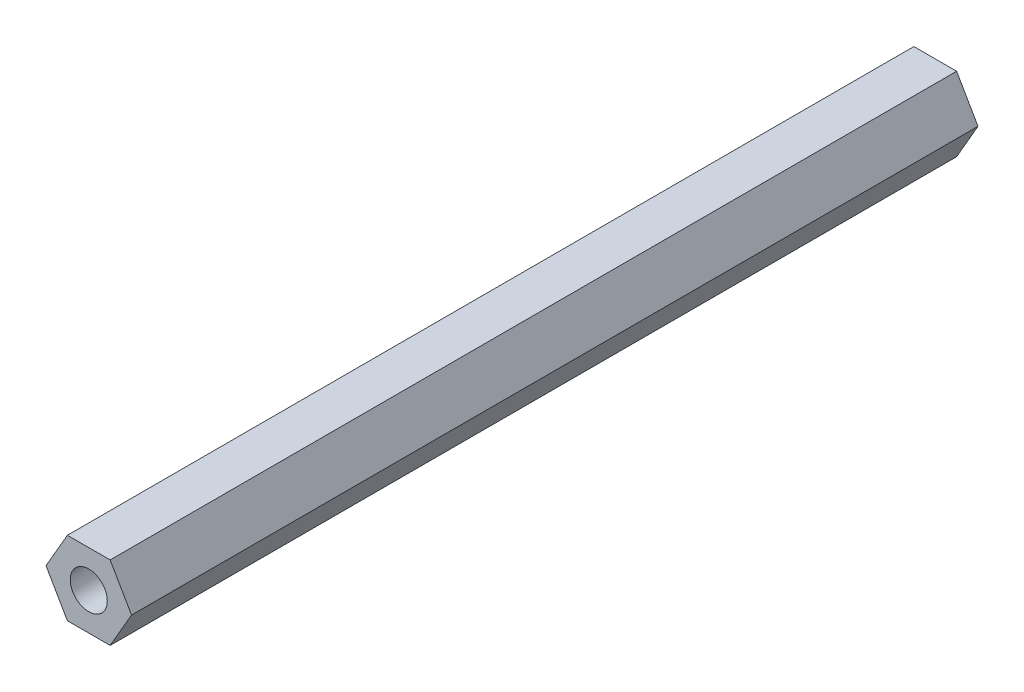
ISO-10303-21;
HEADER;
FILE_DESCRIPTION(('STEP AP214'),'2;1');
FILE_NAME('part.step','',(''),(''),'','','');
FILE_SCHEMA(('AUTOMOTIVE_DESIGN { 1 0 10303 214 1 1 1 1 }'));
ENDSEC;
DATA;
#1=APPLICATION_CONTEXT('core data for automotive mechanical design processes');
#2=APPLICATION_PROTOCOL_DEFINITION('international standard','automotive_design',2000,#1);
#3=PRODUCT_CONTEXT('',#1,'mechanical');
#4=PRODUCT('Part','Part','',(#3));
#5=PRODUCT_RELATED_PRODUCT_CATEGORY('part','',(#4));
#6=PRODUCT_DEFINITION_FORMATION('','',#4);
#7=PRODUCT_DEFINITION_CONTEXT('part definition',#1,'design');
#8=PRODUCT_DEFINITION('design','',#6,#7);
#9=PRODUCT_DEFINITION_SHAPE('','',#8);
#10=(LENGTH_UNIT() NAMED_UNIT(*) SI_UNIT(.MILLI.,.METRE.));
#11=(NAMED_UNIT(*) PLANE_ANGLE_UNIT() SI_UNIT($,.RADIAN.));
#12=(NAMED_UNIT(*) SI_UNIT($,.STERADIAN.) SOLID_ANGLE_UNIT());
#13=UNCERTAINTY_MEASURE_WITH_UNIT(LENGTH_MEASURE(1.E-05),#10,'distance_accuracy_value','');
#14=(GEOMETRIC_REPRESENTATION_CONTEXT(3) GLOBAL_UNCERTAINTY_ASSIGNED_CONTEXT((#13)) GLOBAL_UNIT_ASSIGNED_CONTEXT((#10,
#11,#12)) REPRESENTATION_CONTEXT('',''));
#15=CARTESIAN_POINT('',(0.,0.,0.));
#16=DIRECTION('',(0.,0.,1.));
#17=DIRECTION('',(1.,0.,0.));
#18=AXIS2_PLACEMENT_3D('',#15,#16,#17);
#19=CARTESIAN_POINT('',(2.02072594216369,-3.50000000000001,80.));
#20=DIRECTION('',(-0.866025403784439,0.5,0.));
#21=DIRECTION('',(-0.5,-0.866025403784439,0.));
#22=AXIS2_PLACEMENT_3D('',#19,#20,#21);
#23=PLANE('',#22);
#24=DIRECTION('',(0.5,0.866025403784439,0.));
#25=VECTOR('',#24,1.);
#26=CARTESIAN_POINT('',(2.02072594216369,-3.50000000000001,0.));
#27=LINE('',#26,#25);
#28=CARTESIAN_POINT('',(2.02072594216369,-3.50000000000001,0.));
#29=VERTEX_POINT('',#28);
#30=CARTESIAN_POINT('',(4.04145188432738,0.,0.));
#31=VERTEX_POINT('',#30);
#32=EDGE_CURVE('E117',#29,#31,#27,.T.);
#33=ORIENTED_EDGE('',*,*,#32,.T.);
#34=DIRECTION('',(0.,0.,-1.));
#35=VECTOR('',#34,1.);
#36=CARTESIAN_POINT('',(4.04145188432738,0.,80.));
#37=LINE('',#36,#35);
#38=CARTESIAN_POINT('',(4.04145188432738,0.,80.));
#39=VERTEX_POINT('',#38);
#40=EDGE_CURVE('E11',#39,#31,#37,.T.);
#41=ORIENTED_EDGE('',*,*,#40,.F.);
#42=DIRECTION('',(0.5,0.866025403784439,0.));
#43=VECTOR('',#42,1.);
#44=CARTESIAN_POINT('',(2.02072594216369,-3.50000000000001,80.));
#45=LINE('',#44,#43);
#46=CARTESIAN_POINT('',(2.02072594216369,-3.50000000000001,80.));
#47=VERTEX_POINT('',#46);
#48=EDGE_CURVE('E128',#47,#39,#45,.T.);
#49=ORIENTED_EDGE('',*,*,#48,.F.);
#50=DIRECTION('',(0.,0.,-1.));
#51=VECTOR('',#50,1.);
#52=CARTESIAN_POINT('',(2.02072594216369,-3.50000000000001,80.));
#53=LINE('',#52,#51);
#54=EDGE_CURVE('E113',#47,#29,#53,.T.);
#55=ORIENTED_EDGE('',*,*,#54,.T.);
#56=EDGE_LOOP('',(#33,#41,#49,#55));
#57=FACE_BOUND('',#56,.T.);
#58=ADVANCED_FACE('F33',(#57),#23,.F.);
#59=CARTESIAN_POINT('',(4.04145188432738,0.,80.));
#60=DIRECTION('',(-0.866025403784439,-0.5,0.));
#61=DIRECTION('',(0.5,-0.866025403784439,0.));
#62=AXIS2_PLACEMENT_3D('',#59,#60,#61);
#63=PLANE('',#62);
#64=DIRECTION('',(-0.5,0.866025403784439,0.));
#65=VECTOR('',#64,1.);
#66=CARTESIAN_POINT('',(4.04145188432738,0.,0.));
#67=LINE('',#66,#65);
#68=CARTESIAN_POINT('',(2.02072594216368,3.50000000000002,0.));
#69=VERTEX_POINT('',#68);
#70=EDGE_CURVE('E120',#31,#69,#67,.T.);
#71=ORIENTED_EDGE('',*,*,#70,.T.);
#72=DIRECTION('',(0.,0.,-1.));
#73=VECTOR('',#72,1.);
#74=CARTESIAN_POINT('',(2.02072594216368,3.50000000000002,80.));
#75=LINE('',#74,#73);
#76=CARTESIAN_POINT('',(2.02072594216368,3.50000000000002,80.));
#77=VERTEX_POINT('',#76);
#78=EDGE_CURVE('E41',#77,#69,#75,.T.);
#79=ORIENTED_EDGE('',*,*,#78,.F.);
#80=DIRECTION('',(-0.5,0.866025403784439,0.));
#81=VECTOR('',#80,1.);
#82=CARTESIAN_POINT('',(4.04145188432738,0.,80.));
#83=LINE('',#82,#81);
#84=EDGE_CURVE('E86',#39,#77,#83,.T.);
#85=ORIENTED_EDGE('',*,*,#84,.F.);
#86=ORIENTED_EDGE('',*,*,#40,.T.);
#87=EDGE_LOOP('',(#71,#79,#85,#86));
#88=FACE_BOUND('',#87,.T.);
#89=ADVANCED_FACE('F153',(#88),#63,.F.);
#90=CARTESIAN_POINT('',(2.02072594216368,3.50000000000002,80.));
#91=DIRECTION('',(0.,-1.,0.));
#92=DIRECTION('',(1.,0.,0.));
#93=AXIS2_PLACEMENT_3D('',#90,#91,#92);
#94=PLANE('',#93);
#95=DIRECTION('',(-1.,0.,0.));
#96=VECTOR('',#95,1.);
#97=CARTESIAN_POINT('',(2.02072594216368,3.50000000000002,0.));
#98=LINE('',#97,#96);
#99=CARTESIAN_POINT('',(-2.02072594216369,3.50000000000001,0.));
#100=VERTEX_POINT('',#99);
#101=EDGE_CURVE('E123',#69,#100,#98,.T.);
#102=ORIENTED_EDGE('',*,*,#101,.T.);
#103=DIRECTION('',(0.,0.,-1.));
#104=VECTOR('',#103,1.);
#105=CARTESIAN_POINT('',(-2.02072594216369,3.50000000000001,80.));
#106=LINE('',#105,#104);
#107=CARTESIAN_POINT('',(-2.02072594216369,3.50000000000001,80.));
#108=VERTEX_POINT('',#107);
#109=EDGE_CURVE('E108',#108,#100,#106,.T.);
#110=ORIENTED_EDGE('',*,*,#109,.F.);
#111=DIRECTION('',(-1.,0.,0.));
#112=VECTOR('',#111,1.);
#113=CARTESIAN_POINT('',(2.02072594216368,3.50000000000002,80.));
#114=LINE('',#113,#112);
#115=EDGE_CURVE('E99',#77,#108,#114,.T.);
#116=ORIENTED_EDGE('',*,*,#115,.F.);
#117=ORIENTED_EDGE('',*,*,#78,.T.);
#118=EDGE_LOOP('',(#102,#110,#116,#117));
#119=FACE_BOUND('',#118,.T.);
#120=ADVANCED_FACE('F134',(#119),#94,.F.);
#121=CARTESIAN_POINT('',(-2.02072594216369,3.50000000000001,80.));
#122=DIRECTION('',(0.866025403784439,-0.5,0.));
#123=DIRECTION('',(0.5,0.866025403784439,0.));
#124=AXIS2_PLACEMENT_3D('',#121,#122,#123);
#125=PLANE('',#124);
#126=DIRECTION('',(-0.5,-0.866025403784439,0.));
#127=VECTOR('',#126,1.);
#128=CARTESIAN_POINT('',(-2.02072594216369,3.50000000000001,0.));
#129=LINE('',#128,#127);
#130=CARTESIAN_POINT('',(-4.04145188432739,0.,0.));
#131=VERTEX_POINT('',#130);
#132=EDGE_CURVE('E107',#100,#131,#129,.T.);
#133=ORIENTED_EDGE('',*,*,#132,.T.);
#134=DIRECTION('',(0.,0.,-1.));
#135=VECTOR('',#134,1.);
#136=CARTESIAN_POINT('',(-4.04145188432739,0.,80.));
#137=LINE('',#136,#135);
#138=CARTESIAN_POINT('',(-4.04145188432739,0.,80.));
#139=VERTEX_POINT('',#138);
#140=EDGE_CURVE('E104',#139,#131,#137,.T.);
#141=ORIENTED_EDGE('',*,*,#140,.F.);
#142=DIRECTION('',(-0.5,-0.866025403784439,0.));
#143=VECTOR('',#142,1.);
#144=CARTESIAN_POINT('',(-2.02072594216369,3.50000000000001,80.));
#145=LINE('',#144,#143);
#146=EDGE_CURVE('E93',#108,#139,#145,.T.);
#147=ORIENTED_EDGE('',*,*,#146,.F.);
#148=ORIENTED_EDGE('',*,*,#109,.T.);
#149=EDGE_LOOP('',(#133,#141,#147,#148));
#150=FACE_BOUND('',#149,.T.);
#151=ADVANCED_FACE('F105',(#150),#125,.F.);
#152=CARTESIAN_POINT('',(-4.04145188432739,0.,80.));
#153=DIRECTION('',(0.866025403784438,0.5,0.));
#154=DIRECTION('',(-0.5,0.866025403784439,0.));
#155=AXIS2_PLACEMENT_3D('',#152,#153,#154);
#156=PLANE('',#155);
#157=DIRECTION('',(0.5,-0.866025403784439,0.));
#158=VECTOR('',#157,1.);
#159=CARTESIAN_POINT('',(-4.04145188432739,0.,0.));
#160=LINE('',#159,#158);
#161=CARTESIAN_POINT('',(-2.0207259421637,-3.5,0.));
#162=VERTEX_POINT('',#161);
#163=EDGE_CURVE('E72',#131,#162,#160,.T.);
#164=ORIENTED_EDGE('',*,*,#163,.T.);
#165=DIRECTION('',(0.,0.,-1.));
#166=VECTOR('',#165,1.);
#167=CARTESIAN_POINT('',(-2.0207259421637,-3.5,80.));
#168=LINE('',#167,#166);
#169=CARTESIAN_POINT('',(-2.0207259421637,-3.5,80.));
#170=VERTEX_POINT('',#169);
#171=EDGE_CURVE('E109',#170,#162,#168,.T.);
#172=ORIENTED_EDGE('',*,*,#171,.F.);
#173=DIRECTION('',(0.5,-0.866025403784439,0.));
#174=VECTOR('',#173,1.);
#175=CARTESIAN_POINT('',(-4.04145188432739,0.,80.));
#176=LINE('',#175,#174);
#177=EDGE_CURVE('E97',#139,#170,#176,.T.);
#178=ORIENTED_EDGE('',*,*,#177,.F.);
#179=ORIENTED_EDGE('',*,*,#140,.T.);
#180=EDGE_LOOP('',(#164,#172,#178,#179));
#181=FACE_BOUND('',#180,.T.);
#182=ADVANCED_FACE('F111',(#181),#156,.F.);
#183=CARTESIAN_POINT('',(-2.0207259421637,-3.5,80.));
#184=DIRECTION('',(0.,1.,0.));
#185=DIRECTION('',(-1.,0.,0.));
#186=AXIS2_PLACEMENT_3D('',#183,#184,#185);
#187=PLANE('',#186);
#188=DIRECTION('',(1.,0.,0.));
#189=VECTOR('',#188,1.);
#190=CARTESIAN_POINT('',(-2.0207259421637,-3.5,0.));
#191=LINE('',#190,#189);
#192=EDGE_CURVE('E78',#162,#29,#191,.T.);
#193=ORIENTED_EDGE('',*,*,#192,.T.);
#194=ORIENTED_EDGE('',*,*,#54,.F.);
#195=DIRECTION('',(1.,0.,0.));
#196=VECTOR('',#195,1.);
#197=CARTESIAN_POINT('',(-2.0207259421637,-3.5,80.));
#198=LINE('',#197,#196);
#199=EDGE_CURVE('E49',#170,#47,#198,.T.);
#200=ORIENTED_EDGE('',*,*,#199,.F.);
#201=ORIENTED_EDGE('',*,*,#171,.T.);
#202=EDGE_LOOP('',(#193,#194,#200,#201));
#203=FACE_BOUND('',#202,.T.);
#204=ADVANCED_FACE('F141',(#203),#187,.F.);
#205=CARTESIAN_POINT('',(0.,0.,80.));
#206=DIRECTION('',(0.,0.,1.));
#207=DIRECTION('',(1.,0.,0.));
#208=AXIS2_PLACEMENT_3D('',#205,#206,#207);
#209=PLANE('',#208);
#210=CARTESIAN_POINT('',(0.,0.,80.));
#211=DIRECTION('',(0.,0.,1.));
#212=DIRECTION('',(1.,0.,0.));
#213=AXIS2_PLACEMENT_3D('',#210,#211,#212);
#214=CIRCLE('',#213,1.75);
#215=CARTESIAN_POINT('',(1.75,0.,80.));
#216=VERTEX_POINT('',#215);
#217=EDGE_CURVE('E236',#216,#216,#214,.T.);
#218=ORIENTED_EDGE('',*,*,#217,.F.);
#219=EDGE_LOOP('',(#218));
#220=FACE_BOUND('',#219,.T.);
#221=ORIENTED_EDGE('',*,*,#48,.T.);
#222=ORIENTED_EDGE('',*,*,#84,.T.);
#223=ORIENTED_EDGE('',*,*,#115,.T.);
#224=ORIENTED_EDGE('',*,*,#146,.T.);
#225=ORIENTED_EDGE('',*,*,#177,.T.);
#226=ORIENTED_EDGE('',*,*,#199,.T.);
#227=EDGE_LOOP('',(#221,#222,#223,#224,#225,#226));
#228=FACE_BOUND('',#227,.T.);
#229=ADVANCED_FACE('F95',(#220,#228),#209,.T.);
#230=CARTESIAN_POINT('',(0.,0.,0.));
#231=DIRECTION('',(0.,0.,1.));
#232=DIRECTION('',(1.,0.,0.));
#233=AXIS2_PLACEMENT_3D('',#230,#231,#232);
#234=PLANE('',#233);
#235=CARTESIAN_POINT('',(0.,0.,0.));
#236=DIRECTION('',(0.,0.,-1.));
#237=DIRECTION('',(-1.,0.,0.));
#238=AXIS2_PLACEMENT_3D('',#235,#236,#237);
#239=CIRCLE('',#238,1.75);
#240=CARTESIAN_POINT('',(-1.75,0.,0.));
#241=VERTEX_POINT('',#240);
#242=EDGE_CURVE('E237',#241,#241,#239,.T.);
#243=ORIENTED_EDGE('',*,*,#242,.F.);
#244=EDGE_LOOP('',(#243));
#245=FACE_BOUND('',#244,.T.);
#246=ORIENTED_EDGE('',*,*,#32,.F.);
#247=ORIENTED_EDGE('',*,*,#192,.F.);
#248=ORIENTED_EDGE('',*,*,#163,.F.);
#249=ORIENTED_EDGE('',*,*,#132,.F.);
#250=ORIENTED_EDGE('',*,*,#101,.F.);
#251=ORIENTED_EDGE('',*,*,#70,.F.);
#252=EDGE_LOOP('',(#246,#247,#248,#249,#250,#251));
#253=FACE_BOUND('',#252,.T.);
#254=ADVANCED_FACE('F137',(#245,#253),#234,.F.);
#255=CARTESIAN_POINT('',(0.,0.,73.9));
#256=DIRECTION('',(0.,0.,1.));
#257=DIRECTION('',(1.,0.,0.));
#258=AXIS2_PLACEMENT_3D('',#255,#256,#257);
#259=CYLINDRICAL_SURFACE('',#258,1.75);
#260=CARTESIAN_POINT('',(0.,0.,73.9));
#261=DIRECTION('',(0.,0.,1.));
#262=DIRECTION('',(1.,0.,0.));
#263=AXIS2_PLACEMENT_3D('',#260,#261,#262);
#264=CIRCLE('',#263,1.75);
#265=CARTESIAN_POINT('',(1.75,0.,73.9));
#266=VERTEX_POINT('',#265);
#267=EDGE_CURVE('E121',#266,#266,#264,.T.);
#268=ORIENTED_EDGE('',*,*,#267,.F.);
#269=EDGE_LOOP('',(#268));
#270=FACE_BOUND('',#269,.T.);
#271=ORIENTED_EDGE('',*,*,#217,.T.);
#272=EDGE_LOOP('',(#271));
#273=FACE_BOUND('',#272,.T.);
#274=ADVANCED_FACE('F188',(#270,#273),#259,.F.);
#275=CARTESIAN_POINT('',(0.,0.,73.9));
#276=DIRECTION('',(0.,0.,1.));
#277=DIRECTION('',(1.,0.,0.));
#278=AXIS2_PLACEMENT_3D('',#275,#276,#277);
#279=PLANE('',#278);
#280=ORIENTED_EDGE('',*,*,#267,.T.);
#281=EDGE_LOOP('',(#280));
#282=FACE_BOUND('',#281,.T.);
#283=ADVANCED_FACE('F193',(#282),#279,.T.);
#284=CARTESIAN_POINT('',(0.,0.,6.1));
#285=DIRECTION('',(0.,0.,-1.));
#286=DIRECTION('',(-1.,0.,0.));
#287=AXIS2_PLACEMENT_3D('',#284,#285,#286);
#288=CYLINDRICAL_SURFACE('',#287,1.75);
#289=CARTESIAN_POINT('',(0.,0.,6.1));
#290=DIRECTION('',(0.,0.,-1.));
#291=DIRECTION('',(-1.,0.,0.));
#292=AXIS2_PLACEMENT_3D('',#289,#290,#291);
#293=CIRCLE('',#292,1.75);
#294=CARTESIAN_POINT('',(-1.75,0.,6.1));
#295=VERTEX_POINT('',#294);
#296=EDGE_CURVE('E235',#295,#295,#293,.T.);
#297=ORIENTED_EDGE('',*,*,#296,.F.);
#298=EDGE_LOOP('',(#297));
#299=FACE_BOUND('',#298,.T.);
#300=ORIENTED_EDGE('',*,*,#242,.T.);
#301=EDGE_LOOP('',(#300));
#302=FACE_BOUND('',#301,.T.);
#303=ADVANCED_FACE('F203',(#299,#302),#288,.F.);
#304=CARTESIAN_POINT('',(0.,0.,6.1));
#305=DIRECTION('',(0.,0.,-1.));
#306=DIRECTION('',(-1.,0.,0.));
#307=AXIS2_PLACEMENT_3D('',#304,#305,#306);
#308=PLANE('',#307);
#309=ORIENTED_EDGE('',*,*,#296,.T.);
#310=EDGE_LOOP('',(#309));
#311=FACE_BOUND('',#310,.T.);
#312=ADVANCED_FACE('F219',(#311),#308,.T.);
#313=CLOSED_SHELL('',(#58,#89,#120,#151,#182,#204,#229,#254,#274,#283,#303,#312));
#314=MANIFOLD_SOLID_BREP('B2',#313);
#315=ADVANCED_BREP_SHAPE_REPRESENTATION('',(#18,#314),#14);
#316=SHAPE_DEFINITION_REPRESENTATION(#9,#315);
ENDSEC;
END-ISO-10303-21;
